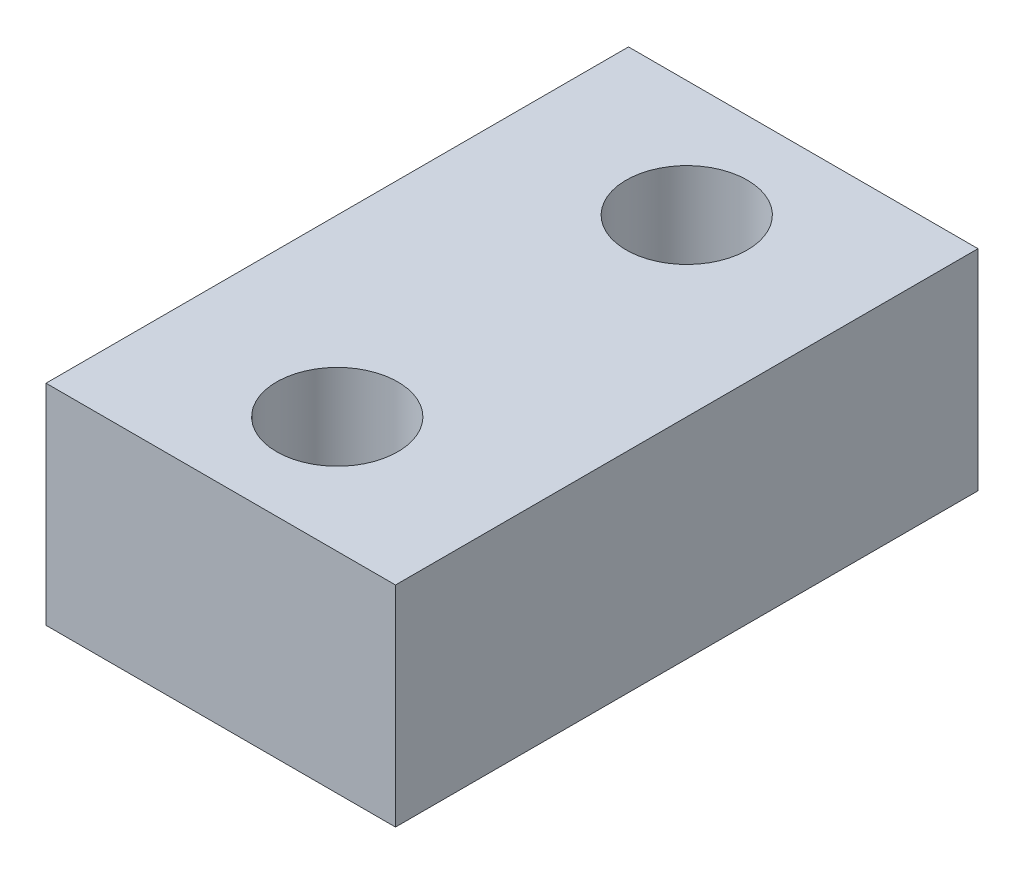
ISO-10303-21;
HEADER;
FILE_DESCRIPTION(('STEP AP214'),'2;1');
FILE_NAME('part.step','',(''),(''),'','','');
FILE_SCHEMA(('AUTOMOTIVE_DESIGN { 1 0 10303 214 1 1 1 1 }'));
ENDSEC;
DATA;
#1=APPLICATION_CONTEXT('core data for automotive mechanical design processes');
#2=APPLICATION_PROTOCOL_DEFINITION('international standard','automotive_design',2000,#1);
#3=PRODUCT_CONTEXT('',#1,'mechanical');
#4=PRODUCT('Part','Part','',(#3));
#5=PRODUCT_RELATED_PRODUCT_CATEGORY('part','',(#4));
#6=PRODUCT_DEFINITION_FORMATION('','',#4);
#7=PRODUCT_DEFINITION_CONTEXT('part definition',#1,'design');
#8=PRODUCT_DEFINITION('design','',#6,#7);
#9=PRODUCT_DEFINITION_SHAPE('','',#8);
#10=(LENGTH_UNIT() NAMED_UNIT(*) SI_UNIT(.MILLI.,.METRE.));
#11=(NAMED_UNIT(*) PLANE_ANGLE_UNIT() SI_UNIT($,.RADIAN.));
#12=(NAMED_UNIT(*) SI_UNIT($,.STERADIAN.) SOLID_ANGLE_UNIT());
#13=UNCERTAINTY_MEASURE_WITH_UNIT(LENGTH_MEASURE(1.E-05),#10,'distance_accuracy_value','');
#14=(GEOMETRIC_REPRESENTATION_CONTEXT(3) GLOBAL_UNCERTAINTY_ASSIGNED_CONTEXT((#13)) GLOBAL_UNIT_ASSIGNED_CONTEXT((#10,
#11,#12)) REPRESENTATION_CONTEXT('',''));
#15=CARTESIAN_POINT('',(0.,0.,0.));
#16=DIRECTION('',(0.,0.,1.));
#17=DIRECTION('',(1.,0.,0.));
#18=AXIS2_PLACEMENT_3D('',#15,#16,#17);
#19=CARTESIAN_POINT('',(-32.5,4.,12.5));
#20=DIRECTION('',(0.,0.,-1.));
#21=DIRECTION('',(-1.,0.,0.));
#22=AXIS2_PLACEMENT_3D('',#19,#20,#21);
#23=PLANE('',#22);
#24=DIRECTION('',(-1.,0.,0.));
#25=VECTOR('',#24,1.);
#26=CARTESIAN_POINT('',(-7.5,8.,12.5));
#27=LINE('',#26,#25);
#28=CARTESIAN_POINT('',(7.5,8.,12.5));
#29=VERTEX_POINT('',#28);
#30=CARTESIAN_POINT('',(-7.5,8.,12.5));
#31=VERTEX_POINT('',#30);
#32=EDGE_CURVE('E59',#29,#31,#27,.T.);
#33=ORIENTED_EDGE('',*,*,#32,.F.);
#34=DIRECTION('',(0.,-1.,0.));
#35=VECTOR('',#34,1.);
#36=CARTESIAN_POINT('',(7.5,17.,12.5));
#37=LINE('',#36,#35);
#38=CARTESIAN_POINT('',(7.5,17.,12.5));
#39=VERTEX_POINT('',#38);
#40=EDGE_CURVE('E100',#39,#29,#37,.T.);
#41=ORIENTED_EDGE('',*,*,#40,.F.);
#42=DIRECTION('',(1.,0.,0.));
#43=VECTOR('',#42,1.);
#44=CARTESIAN_POINT('',(-7.5,17.,12.5));
#45=LINE('',#44,#43);
#46=CARTESIAN_POINT('',(-7.5,17.,12.5));
#47=VERTEX_POINT('',#46);
#48=EDGE_CURVE('E67',#47,#39,#45,.T.);
#49=ORIENTED_EDGE('',*,*,#48,.F.);
#50=DIRECTION('',(0.,-1.,0.));
#51=VECTOR('',#50,1.);
#52=CARTESIAN_POINT('',(-7.5,17.,12.5));
#53=LINE('',#52,#51);
#54=EDGE_CURVE('E125',#47,#31,#53,.T.);
#55=ORIENTED_EDGE('',*,*,#54,.T.);
#56=EDGE_LOOP('',(#33,#41,#49,#55));
#57=FACE_BOUND('',#56,.T.);
#58=ADVANCED_FACE('F43',(#57),#23,.F.);
#59=CARTESIAN_POINT('',(-32.5,4.,-12.5));
#60=DIRECTION('',(0.,0.,1.));
#61=DIRECTION('',(1.,0.,0.));
#62=AXIS2_PLACEMENT_3D('',#59,#60,#61);
#63=PLANE('',#62);
#64=DIRECTION('',(0.,-1.,0.));
#65=VECTOR('',#64,1.);
#66=CARTESIAN_POINT('',(7.5,17.,-12.5));
#67=LINE('',#66,#65);
#68=CARTESIAN_POINT('',(7.5,17.,-12.5));
#69=VERTEX_POINT('',#68);
#70=CARTESIAN_POINT('',(7.5,8.,-12.5));
#71=VERTEX_POINT('',#70);
#72=EDGE_CURVE('E11',#69,#71,#67,.T.);
#73=ORIENTED_EDGE('',*,*,#72,.T.);
#74=DIRECTION('',(-1.,0.,0.));
#75=VECTOR('',#74,1.);
#76=CARTESIAN_POINT('',(-7.5,8.,-12.5));
#77=LINE('',#76,#75);
#78=CARTESIAN_POINT('',(-7.5,8.,-12.5));
#79=VERTEX_POINT('',#78);
#80=EDGE_CURVE('E84',#71,#79,#77,.T.);
#81=ORIENTED_EDGE('',*,*,#80,.T.);
#82=DIRECTION('',(0.,-1.,0.));
#83=VECTOR('',#82,1.);
#84=CARTESIAN_POINT('',(-7.5,17.,-12.5));
#85=LINE('',#84,#83);
#86=CARTESIAN_POINT('',(-7.5,17.,-12.5));
#87=VERTEX_POINT('',#86);
#88=EDGE_CURVE('E52',#87,#79,#85,.T.);
#89=ORIENTED_EDGE('',*,*,#88,.F.);
#90=DIRECTION('',(-1.,0.,0.));
#91=VECTOR('',#90,1.);
#92=CARTESIAN_POINT('',(-7.5,17.,-12.5));
#93=LINE('',#92,#91);
#94=EDGE_CURVE('E103',#69,#87,#93,.T.);
#95=ORIENTED_EDGE('',*,*,#94,.F.);
#96=EDGE_LOOP('',(#73,#81,#89,#95));
#97=FACE_BOUND('',#96,.T.);
#98=ADVANCED_FACE('F45',(#97),#63,.F.);
#99=CARTESIAN_POINT('',(7.5,17.,-12.5));
#100=DIRECTION('',(-1.,0.,0.));
#101=DIRECTION('',(0.,0.,1.));
#102=AXIS2_PLACEMENT_3D('',#99,#100,#101);
#103=PLANE('',#102);
#104=ORIENTED_EDGE('',*,*,#40,.T.);
#105=DIRECTION('',(0.,0.,1.));
#106=VECTOR('',#105,1.);
#107=CARTESIAN_POINT('',(7.5,8.,-18.5));
#108=LINE('',#107,#106);
#109=EDGE_CURVE('E87',#71,#29,#108,.T.);
#110=ORIENTED_EDGE('',*,*,#109,.F.);
#111=ORIENTED_EDGE('',*,*,#72,.F.);
#112=DIRECTION('',(0.,0.,-1.));
#113=VECTOR('',#112,1.);
#114=CARTESIAN_POINT('',(7.5,17.,-12.5));
#115=LINE('',#114,#113);
#116=EDGE_CURVE('E107',#39,#69,#115,.T.);
#117=ORIENTED_EDGE('',*,*,#116,.F.);
#118=EDGE_LOOP('',(#104,#110,#111,#117));
#119=FACE_BOUND('',#118,.T.);
#120=ADVANCED_FACE('F98',(#119),#103,.F.);
#121=CARTESIAN_POINT('',(-7.5,17.,-12.5));
#122=DIRECTION('',(1.,0.,0.));
#123=DIRECTION('',(0.,0.,-1.));
#124=AXIS2_PLACEMENT_3D('',#121,#122,#123);
#125=PLANE('',#124);
#126=ORIENTED_EDGE('',*,*,#88,.T.);
#127=DIRECTION('',(0.,0.,1.));
#128=VECTOR('',#127,1.);
#129=CARTESIAN_POINT('',(-7.5,8.,-18.5));
#130=LINE('',#129,#128);
#131=EDGE_CURVE('E88',#79,#31,#130,.T.);
#132=ORIENTED_EDGE('',*,*,#131,.T.);
#133=ORIENTED_EDGE('',*,*,#54,.F.);
#134=DIRECTION('',(0.,0.,1.));
#135=VECTOR('',#134,1.);
#136=CARTESIAN_POINT('',(-7.5,17.,-12.5));
#137=LINE('',#136,#135);
#138=EDGE_CURVE('E106',#87,#47,#137,.T.);
#139=ORIENTED_EDGE('',*,*,#138,.F.);
#140=EDGE_LOOP('',(#126,#132,#133,#139));
#141=FACE_BOUND('',#140,.T.);
#142=ADVANCED_FACE('F130',(#141),#125,.F.);
#143=CARTESIAN_POINT('',(0.,17.,0.));
#144=DIRECTION('',(0.,1.,0.));
#145=DIRECTION('',(0.,0.,1.));
#146=AXIS2_PLACEMENT_3D('',#143,#144,#145);
#147=PLANE('',#146);
#148=CARTESIAN_POINT('',(0.,17.,-7.49999999999999));
#149=DIRECTION('',(0.,-1.,0.));
#150=DIRECTION('',(0.,0.,-1.));
#151=AXIS2_PLACEMENT_3D('',#148,#149,#150);
#152=CIRCLE('',#151,2.6);
#153=CARTESIAN_POINT('',(0.,17.,-10.1));
#154=VERTEX_POINT('',#153);
#155=EDGE_CURVE('E111',#154,#154,#152,.T.);
#156=ORIENTED_EDGE('',*,*,#155,.T.);
#157=EDGE_LOOP('',(#156));
#158=FACE_BOUND('',#157,.T.);
#159=CARTESIAN_POINT('',(0.,17.,7.49999999999999));
#160=DIRECTION('',(0.,-1.,0.));
#161=DIRECTION('',(0.,0.,1.));
#162=AXIS2_PLACEMENT_3D('',#159,#160,#161);
#163=CIRCLE('',#162,2.6);
#164=CARTESIAN_POINT('',(0.,17.,10.1));
#165=VERTEX_POINT('',#164);
#166=EDGE_CURVE('E115',#165,#165,#163,.T.);
#167=ORIENTED_EDGE('',*,*,#166,.T.);
#168=EDGE_LOOP('',(#167));
#169=FACE_BOUND('',#168,.T.);
#170=ORIENTED_EDGE('',*,*,#116,.T.);
#171=ORIENTED_EDGE('',*,*,#94,.T.);
#172=ORIENTED_EDGE('',*,*,#138,.T.);
#173=ORIENTED_EDGE('',*,*,#48,.T.);
#174=EDGE_LOOP('',(#170,#171,#172,#173));
#175=FACE_BOUND('',#174,.T.);
#176=ADVANCED_FACE('F109',(#158,#169,#175),#147,.T.);
#177=CARTESIAN_POINT('',(0.,17.,7.49999999999999));
#178=DIRECTION('',(0.,-1.,0.));
#179=DIRECTION('',(0.,0.,-1.));
#180=AXIS2_PLACEMENT_3D('',#177,#178,#179);
#181=CYLINDRICAL_SURFACE('',#180,2.6);
#182=CARTESIAN_POINT('',(0.,8.,7.49999999999999));
#183=DIRECTION('',(0.,1.,0.));
#184=DIRECTION('',(0.,0.,1.));
#185=AXIS2_PLACEMENT_3D('',#182,#183,#184);
#186=CIRCLE('',#185,2.6);
#187=CARTESIAN_POINT('',(0.,8.,10.1));
#188=VERTEX_POINT('',#187);
#189=EDGE_CURVE('E93',#188,#188,#186,.F.);
#190=ORIENTED_EDGE('',*,*,#189,.T.);
#191=EDGE_LOOP('',(#190));
#192=FACE_BOUND('',#191,.T.);
#193=ORIENTED_EDGE('',*,*,#166,.F.);
#194=EDGE_LOOP('',(#193));
#195=FACE_BOUND('',#194,.T.);
#196=ADVANCED_FACE('F156',(#192,#195),#181,.F.);
#197=CARTESIAN_POINT('',(0.,17.,-7.49999999999999));
#198=DIRECTION('',(0.,-1.,0.));
#199=DIRECTION('',(0.,0.,-1.));
#200=AXIS2_PLACEMENT_3D('',#197,#198,#199);
#201=CYLINDRICAL_SURFACE('',#200,2.6);
#202=CARTESIAN_POINT('',(0.,8.,-7.49999999999999));
#203=DIRECTION('',(0.,1.,0.));
#204=DIRECTION('',(0.,0.,1.));
#205=AXIS2_PLACEMENT_3D('',#202,#203,#204);
#206=CIRCLE('',#205,2.6);
#207=CARTESIAN_POINT('',(0.,8.,-4.89999999999999));
#208=VERTEX_POINT('',#207);
#209=EDGE_CURVE('E141',#208,#208,#206,.F.);
#210=ORIENTED_EDGE('',*,*,#209,.T.);
#211=EDGE_LOOP('',(#210));
#212=FACE_BOUND('',#211,.T.);
#213=ORIENTED_EDGE('',*,*,#155,.F.);
#214=EDGE_LOOP('',(#213));
#215=FACE_BOUND('',#214,.T.);
#216=ADVANCED_FACE('F148',(#212,#215),#201,.F.);
#217=CARTESIAN_POINT('',(-7.5,8.,-18.5));
#218=DIRECTION('',(0.,1.,0.));
#219=DIRECTION('',(0.,0.,1.));
#220=AXIS2_PLACEMENT_3D('',#217,#218,#219);
#221=PLANE('',#220);
#222=ORIENTED_EDGE('',*,*,#209,.F.);
#223=EDGE_LOOP('',(#222));
#224=FACE_BOUND('',#223,.T.);
#225=ORIENTED_EDGE('',*,*,#189,.F.);
#226=EDGE_LOOP('',(#225));
#227=FACE_BOUND('',#226,.T.);
#228=ORIENTED_EDGE('',*,*,#131,.F.);
#229=ORIENTED_EDGE('',*,*,#80,.F.);
#230=ORIENTED_EDGE('',*,*,#109,.T.);
#231=ORIENTED_EDGE('',*,*,#32,.T.);
#232=EDGE_LOOP('',(#228,#229,#230,#231));
#233=FACE_BOUND('',#232,.T.);
#234=ADVANCED_FACE('F86',(#224,#227,#233),#221,.F.);
#235=CLOSED_SHELL('',(#58,#98,#120,#142,#176,#196,#216,#234));
#236=MANIFOLD_SOLID_BREP('B2',#235);
#237=ADVANCED_BREP_SHAPE_REPRESENTATION('',(#18,#236),#14);
#238=SHAPE_DEFINITION_REPRESENTATION(#9,#237);
ENDSEC;
END-ISO-10303-21;
